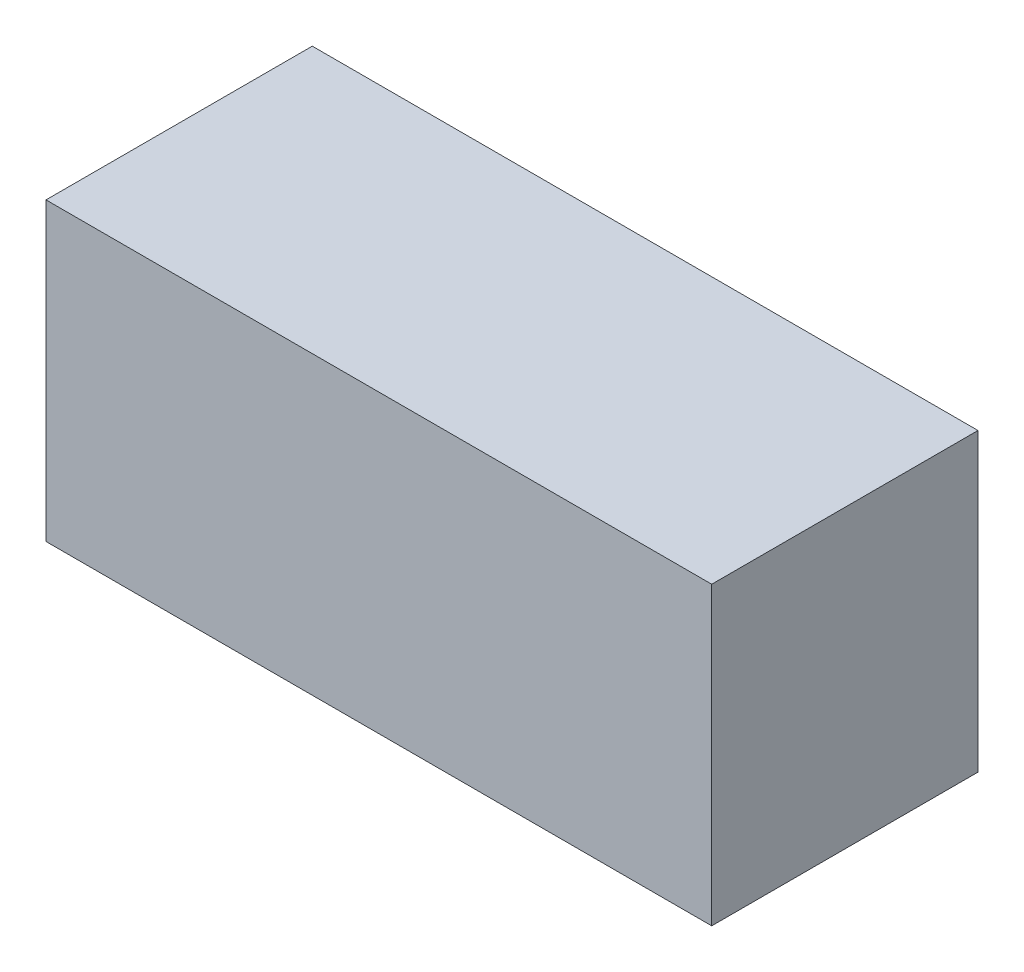
ISO-10303-21;
HEADER;
FILE_DESCRIPTION(('STEP AP214'),'2;1');
FILE_NAME('part.step','',(''),(''),'','','');
FILE_SCHEMA(('AUTOMOTIVE_DESIGN { 1 0 10303 214 1 1 1 1 }'));
ENDSEC;
DATA;
#1=APPLICATION_CONTEXT('core data for automotive mechanical design processes');
#2=APPLICATION_PROTOCOL_DEFINITION('international standard','automotive_design',2000,#1);
#3=PRODUCT_CONTEXT('',#1,'mechanical');
#4=PRODUCT('Part','Part','',(#3));
#5=PRODUCT_RELATED_PRODUCT_CATEGORY('part','',(#4));
#6=PRODUCT_DEFINITION_FORMATION('','',#4);
#7=PRODUCT_DEFINITION_CONTEXT('part definition',#1,'design');
#8=PRODUCT_DEFINITION('design','',#6,#7);
#9=PRODUCT_DEFINITION_SHAPE('','',#8);
#10=(LENGTH_UNIT() NAMED_UNIT(*) SI_UNIT(.MILLI.,.METRE.));
#11=(NAMED_UNIT(*) PLANE_ANGLE_UNIT() SI_UNIT($,.RADIAN.));
#12=(NAMED_UNIT(*) SI_UNIT($,.STERADIAN.) SOLID_ANGLE_UNIT());
#13=UNCERTAINTY_MEASURE_WITH_UNIT(LENGTH_MEASURE(1.E-05),#10,'distance_accuracy_value','');
#14=(GEOMETRIC_REPRESENTATION_CONTEXT(3) GLOBAL_UNCERTAINTY_ASSIGNED_CONTEXT((#13)) GLOBAL_UNIT_ASSIGNED_CONTEXT((#10,
#11,#12)) REPRESENTATION_CONTEXT('',''));
#15=CARTESIAN_POINT('',(0.,0.,0.));
#16=DIRECTION('',(0.,0.,1.));
#17=DIRECTION('',(1.,0.,0.));
#18=AXIS2_PLACEMENT_3D('',#15,#16,#17);
#19=CARTESIAN_POINT('',(225.,100.,180.));
#20=DIRECTION('',(-1.,0.,0.));
#21=DIRECTION('',(0.,0.,1.));
#22=AXIS2_PLACEMENT_3D('',#19,#20,#21);
#23=PLANE('',#22);
#24=DIRECTION('',(0.,1.,0.));
#25=VECTOR('',#24,1.);
#26=CARTESIAN_POINT('',(225.,100.,0.));
#27=LINE('',#26,#25);
#28=CARTESIAN_POINT('',(225.,-100.,0.));
#29=VERTEX_POINT('',#28);
#30=CARTESIAN_POINT('',(225.,100.,0.));
#31=VERTEX_POINT('',#30);
#32=EDGE_CURVE('E102',#29,#31,#27,.T.);
#33=ORIENTED_EDGE('',*,*,#32,.T.);
#34=DIRECTION('',(0.,0.,-1.));
#35=VECTOR('',#34,1.);
#36=CARTESIAN_POINT('',(225.,100.,180.));
#37=LINE('',#36,#35);
#38=CARTESIAN_POINT('',(225.,100.,180.));
#39=VERTEX_POINT('',#38);
#40=EDGE_CURVE('E11',#39,#31,#37,.T.);
#41=ORIENTED_EDGE('',*,*,#40,.F.);
#42=DIRECTION('',(0.,1.,0.));
#43=VECTOR('',#42,1.);
#44=CARTESIAN_POINT('',(225.,100.,180.));
#45=LINE('',#44,#43);
#46=CARTESIAN_POINT('',(225.,-100.,180.));
#47=VERTEX_POINT('',#46);
#48=EDGE_CURVE('E90',#47,#39,#45,.T.);
#49=ORIENTED_EDGE('',*,*,#48,.F.);
#50=DIRECTION('',(0.,0.,-1.));
#51=VECTOR('',#50,1.);
#52=CARTESIAN_POINT('',(225.,-100.,180.));
#53=LINE('',#52,#51);
#54=EDGE_CURVE('E98',#47,#29,#53,.T.);
#55=ORIENTED_EDGE('',*,*,#54,.T.);
#56=EDGE_LOOP('',(#33,#41,#49,#55));
#57=FACE_BOUND('',#56,.T.);
#58=ADVANCED_FACE('F39',(#57),#23,.F.);
#59=CARTESIAN_POINT('',(-225.,100.,180.));
#60=DIRECTION('',(0.,-1.,0.));
#61=DIRECTION('',(0.,0.,-1.));
#62=AXIS2_PLACEMENT_3D('',#59,#60,#61);
#63=PLANE('',#62);
#64=DIRECTION('',(-1.,0.,0.));
#65=VECTOR('',#64,1.);
#66=CARTESIAN_POINT('',(-225.,100.,0.));
#67=LINE('',#66,#65);
#68=CARTESIAN_POINT('',(-225.,100.,0.));
#69=VERTEX_POINT('',#68);
#70=EDGE_CURVE('E94',#31,#69,#67,.T.);
#71=ORIENTED_EDGE('',*,*,#70,.T.);
#72=DIRECTION('',(0.,0.,-1.));
#73=VECTOR('',#72,1.);
#74=CARTESIAN_POINT('',(-225.,100.,180.));
#75=LINE('',#74,#73);
#76=CARTESIAN_POINT('',(-225.,100.,180.));
#77=VERTEX_POINT('',#76);
#78=EDGE_CURVE('E47',#77,#69,#75,.T.);
#79=ORIENTED_EDGE('',*,*,#78,.F.);
#80=DIRECTION('',(-1.,0.,0.));
#81=VECTOR('',#80,1.);
#82=CARTESIAN_POINT('',(-225.,100.,180.));
#83=LINE('',#82,#81);
#84=EDGE_CURVE('E85',#39,#77,#83,.T.);
#85=ORIENTED_EDGE('',*,*,#84,.F.);
#86=ORIENTED_EDGE('',*,*,#40,.T.);
#87=EDGE_LOOP('',(#71,#79,#85,#86));
#88=FACE_BOUND('',#87,.T.);
#89=ADVANCED_FACE('F93',(#88),#63,.F.);
#90=CARTESIAN_POINT('',(-225.,100.,180.));
#91=DIRECTION('',(1.,0.,0.));
#92=DIRECTION('',(0.,0.,-1.));
#93=AXIS2_PLACEMENT_3D('',#90,#91,#92);
#94=PLANE('',#93);
#95=DIRECTION('',(0.,-1.,0.));
#96=VECTOR('',#95,1.);
#97=CARTESIAN_POINT('',(-225.,100.,0.));
#98=LINE('',#97,#96);
#99=CARTESIAN_POINT('',(-225.,-100.,0.));
#100=VERTEX_POINT('',#99);
#101=EDGE_CURVE('E72',#69,#100,#98,.T.);
#102=ORIENTED_EDGE('',*,*,#101,.T.);
#103=DIRECTION('',(0.,0.,-1.));
#104=VECTOR('',#103,1.);
#105=CARTESIAN_POINT('',(-225.,-100.,180.));
#106=LINE('',#105,#104);
#107=CARTESIAN_POINT('',(-225.,-100.,180.));
#108=VERTEX_POINT('',#107);
#109=EDGE_CURVE('E95',#108,#100,#106,.T.);
#110=ORIENTED_EDGE('',*,*,#109,.F.);
#111=DIRECTION('',(0.,-1.,0.));
#112=VECTOR('',#111,1.);
#113=CARTESIAN_POINT('',(-225.,100.,180.));
#114=LINE('',#113,#112);
#115=EDGE_CURVE('E88',#77,#108,#114,.T.);
#116=ORIENTED_EDGE('',*,*,#115,.F.);
#117=ORIENTED_EDGE('',*,*,#78,.T.);
#118=EDGE_LOOP('',(#102,#110,#116,#117));
#119=FACE_BOUND('',#118,.T.);
#120=ADVANCED_FACE('F96',(#119),#94,.F.);
#121=CARTESIAN_POINT('',(-225.,-100.,180.));
#122=DIRECTION('',(0.,1.,0.));
#123=DIRECTION('',(0.,0.,1.));
#124=AXIS2_PLACEMENT_3D('',#121,#122,#123);
#125=PLANE('',#124);
#126=DIRECTION('',(1.,0.,0.));
#127=VECTOR('',#126,1.);
#128=CARTESIAN_POINT('',(-225.,-100.,0.));
#129=LINE('',#128,#127);
#130=EDGE_CURVE('E78',#100,#29,#129,.T.);
#131=ORIENTED_EDGE('',*,*,#130,.T.);
#132=ORIENTED_EDGE('',*,*,#54,.F.);
#133=DIRECTION('',(1.,0.,0.));
#134=VECTOR('',#133,1.);
#135=CARTESIAN_POINT('',(-225.,-100.,180.));
#136=LINE('',#135,#134);
#137=EDGE_CURVE('E55',#108,#47,#136,.T.);
#138=ORIENTED_EDGE('',*,*,#137,.F.);
#139=ORIENTED_EDGE('',*,*,#109,.T.);
#140=EDGE_LOOP('',(#131,#132,#138,#139));
#141=FACE_BOUND('',#140,.T.);
#142=ADVANCED_FACE('F109',(#141),#125,.F.);
#143=CARTESIAN_POINT('',(0.,0.,180.));
#144=DIRECTION('',(0.,0.,1.));
#145=DIRECTION('',(1.,0.,0.));
#146=AXIS2_PLACEMENT_3D('',#143,#144,#145);
#147=PLANE('',#146);
#148=ORIENTED_EDGE('',*,*,#48,.T.);
#149=ORIENTED_EDGE('',*,*,#84,.T.);
#150=ORIENTED_EDGE('',*,*,#115,.T.);
#151=ORIENTED_EDGE('',*,*,#137,.T.);
#152=EDGE_LOOP('',(#148,#149,#150,#151));
#153=FACE_BOUND('',#152,.T.);
#154=ADVANCED_FACE('F86',(#153),#147,.T.);
#155=CARTESIAN_POINT('',(0.,0.,0.));
#156=DIRECTION('',(0.,0.,1.));
#157=DIRECTION('',(1.,0.,0.));
#158=AXIS2_PLACEMENT_3D('',#155,#156,#157);
#159=PLANE('',#158);
#160=ORIENTED_EDGE('',*,*,#32,.F.);
#161=ORIENTED_EDGE('',*,*,#130,.F.);
#162=ORIENTED_EDGE('',*,*,#101,.F.);
#163=ORIENTED_EDGE('',*,*,#70,.F.);
#164=EDGE_LOOP('',(#160,#161,#162,#163));
#165=FACE_BOUND('',#164,.T.);
#166=ADVANCED_FACE('F112',(#165),#159,.F.);
#167=CLOSED_SHELL('',(#58,#89,#120,#142,#154,#166));
#168=MANIFOLD_SOLID_BREP('B2',#167);
#169=ADVANCED_BREP_SHAPE_REPRESENTATION('',(#18,#168),#14);
#170=SHAPE_DEFINITION_REPRESENTATION(#9,#169);
ENDSEC;
END-ISO-10303-21;
